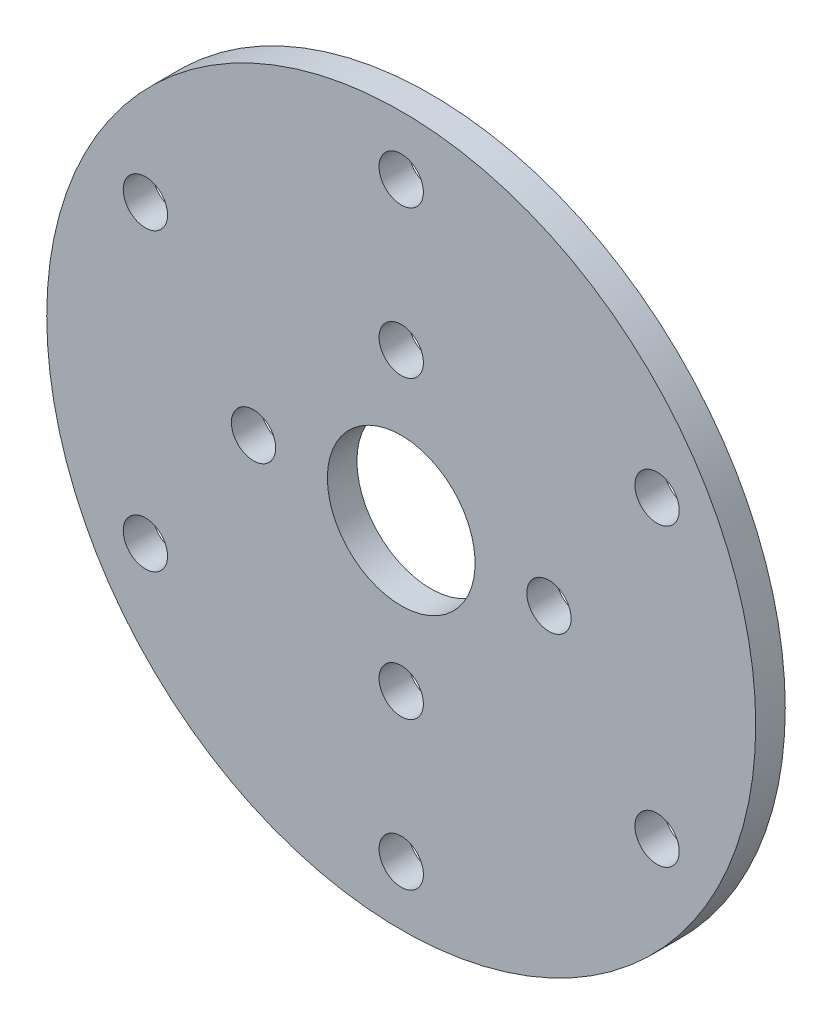
ISO-10303-21;
HEADER;
FILE_DESCRIPTION(('STEP AP214'),'2;1');
FILE_NAME('part.step','',(''),(''),'','','');
FILE_SCHEMA(('AUTOMOTIVE_DESIGN { 1 0 10303 214 1 1 1 1 }'));
ENDSEC;
DATA;
#1=APPLICATION_CONTEXT('core data for automotive mechanical design processes');
#2=APPLICATION_PROTOCOL_DEFINITION('international standard','automotive_design',2000,#1);
#3=PRODUCT_CONTEXT('',#1,'mechanical');
#4=PRODUCT('Part','Part','',(#3));
#5=PRODUCT_RELATED_PRODUCT_CATEGORY('part','',(#4));
#6=PRODUCT_DEFINITION_FORMATION('','',#4);
#7=PRODUCT_DEFINITION_CONTEXT('part definition',#1,'design');
#8=PRODUCT_DEFINITION('design','',#6,#7);
#9=PRODUCT_DEFINITION_SHAPE('','',#8);
#10=(LENGTH_UNIT() NAMED_UNIT(*) SI_UNIT(.MILLI.,.METRE.));
#11=(NAMED_UNIT(*) PLANE_ANGLE_UNIT() SI_UNIT($,.RADIAN.));
#12=(NAMED_UNIT(*) SI_UNIT($,.STERADIAN.) SOLID_ANGLE_UNIT());
#13=UNCERTAINTY_MEASURE_WITH_UNIT(LENGTH_MEASURE(1.E-05),#10,'distance_accuracy_value','');
#14=(GEOMETRIC_REPRESENTATION_CONTEXT(3) GLOBAL_UNCERTAINTY_ASSIGNED_CONTEXT((#13)) GLOBAL_UNIT_ASSIGNED_CONTEXT((#10,
#11,#12)) REPRESENTATION_CONTEXT('',''));
#15=CARTESIAN_POINT('',(0.,0.,0.));
#16=DIRECTION('',(0.,0.,1.));
#17=DIRECTION('',(1.,0.,0.));
#18=AXIS2_PLACEMENT_3D('',#15,#16,#17);
#19=CARTESIAN_POINT('',(0.,0.,0.));
#20=DIRECTION('',(0.,0.,1.));
#21=DIRECTION('',(1.,0.,0.));
#22=AXIS2_PLACEMENT_3D('',#19,#20,#21);
#23=CYLINDRICAL_SURFACE('',#22,24.);
#24=CARTESIAN_POINT('',(0.,0.,0.));
#25=DIRECTION('',(0.,0.,1.));
#26=DIRECTION('',(-1.,0.,0.));
#27=AXIS2_PLACEMENT_3D('',#24,#25,#26);
#28=CIRCLE('',#27,24.);
#29=CARTESIAN_POINT('',(-24.,0.,0.));
#30=VERTEX_POINT('',#29);
#31=EDGE_CURVE('E10',#30,#30,#28,.T.);
#32=ORIENTED_EDGE('',*,*,#31,.T.);
#33=EDGE_LOOP('',(#32));
#34=FACE_BOUND('',#33,.T.);
#35=CARTESIAN_POINT('',(0.,0.,2.));
#36=DIRECTION('',(0.,0.,1.));
#37=DIRECTION('',(-1.,0.,0.));
#38=AXIS2_PLACEMENT_3D('',#35,#36,#37);
#39=CIRCLE('',#38,24.);
#40=CARTESIAN_POINT('',(-24.,0.,2.));
#41=VERTEX_POINT('',#40);
#42=EDGE_CURVE('E33',#41,#41,#39,.T.);
#43=ORIENTED_EDGE('',*,*,#42,.F.);
#44=EDGE_LOOP('',(#43));
#45=FACE_BOUND('',#44,.T.);
#46=ADVANCED_FACE('F30',(#34,#45),#23,.T.);
#47=CARTESIAN_POINT('',(0.,0.,0.));
#48=DIRECTION('',(0.,0.,-1.));
#49=DIRECTION('',(-1.,0.,0.));
#50=AXIS2_PLACEMENT_3D('',#47,#48,#49);
#51=PLANE('',#50);
#52=CARTESIAN_POINT('',(10.,0.,0.));
#53=DIRECTION('',(0.,0.,1.));
#54=DIRECTION('',(-1.,0.,0.));
#55=AXIS2_PLACEMENT_3D('',#52,#53,#54);
#56=CIRCLE('',#55,1.5);
#57=CARTESIAN_POINT('',(8.5,0.,0.));
#58=VERTEX_POINT('',#57);
#59=EDGE_CURVE('E99',#58,#58,#56,.T.);
#60=ORIENTED_EDGE('',*,*,#59,.T.);
#61=EDGE_LOOP('',(#60));
#62=FACE_BOUND('',#61,.T.);
#63=CARTESIAN_POINT('',(0.,-10.,0.));
#64=DIRECTION('',(0.,0.,1.));
#65=DIRECTION('',(-1.,0.,0.));
#66=AXIS2_PLACEMENT_3D('',#63,#64,#65);
#67=CIRCLE('',#66,1.5);
#68=CARTESIAN_POINT('',(-1.5,-10.,0.));
#69=VERTEX_POINT('',#68);
#70=EDGE_CURVE('E93',#69,#69,#67,.T.);
#71=ORIENTED_EDGE('',*,*,#70,.T.);
#72=EDGE_LOOP('',(#71));
#73=FACE_BOUND('',#72,.T.);
#74=CARTESIAN_POINT('',(-10.,0.,0.));
#75=DIRECTION('',(0.,0.,1.));
#76=DIRECTION('',(-1.,0.,0.));
#77=AXIS2_PLACEMENT_3D('',#74,#75,#76);
#78=CIRCLE('',#77,1.5);
#79=CARTESIAN_POINT('',(-11.5,0.,0.));
#80=VERTEX_POINT('',#79);
#81=EDGE_CURVE('E87',#80,#80,#78,.T.);
#82=ORIENTED_EDGE('',*,*,#81,.T.);
#83=EDGE_LOOP('',(#82));
#84=FACE_BOUND('',#83,.T.);
#85=CARTESIAN_POINT('',(0.,10.,0.));
#86=DIRECTION('',(0.,0.,1.));
#87=DIRECTION('',(-1.,0.,0.));
#88=AXIS2_PLACEMENT_3D('',#85,#86,#87);
#89=CIRCLE('',#88,1.5);
#90=CARTESIAN_POINT('',(-1.5,10.,0.));
#91=VERTEX_POINT('',#90);
#92=EDGE_CURVE('E81',#91,#91,#89,.T.);
#93=ORIENTED_EDGE('',*,*,#92,.T.);
#94=EDGE_LOOP('',(#93));
#95=FACE_BOUND('',#94,.T.);
#96=CARTESIAN_POINT('',(-17.3205080756888,-10.,0.));
#97=DIRECTION('',(0.,0.,1.));
#98=DIRECTION('',(-1.,0.,0.));
#99=AXIS2_PLACEMENT_3D('',#96,#97,#98);
#100=CIRCLE('',#99,1.5);
#101=CARTESIAN_POINT('',(-18.8205080756888,-10.,0.));
#102=VERTEX_POINT('',#101);
#103=EDGE_CURVE('E75',#102,#102,#100,.T.);
#104=ORIENTED_EDGE('',*,*,#103,.T.);
#105=EDGE_LOOP('',(#104));
#106=FACE_BOUND('',#105,.T.);
#107=CARTESIAN_POINT('',(17.3205080756888,-10.,0.));
#108=DIRECTION('',(0.,0.,1.));
#109=DIRECTION('',(-1.,0.,0.));
#110=AXIS2_PLACEMENT_3D('',#107,#108,#109);
#111=CIRCLE('',#110,1.5);
#112=CARTESIAN_POINT('',(15.8205080756888,-10.,0.));
#113=VERTEX_POINT('',#112);
#114=EDGE_CURVE('E69',#113,#113,#111,.T.);
#115=ORIENTED_EDGE('',*,*,#114,.T.);
#116=EDGE_LOOP('',(#115));
#117=FACE_BOUND('',#116,.T.);
#118=CARTESIAN_POINT('',(0.,20.,0.));
#119=DIRECTION('',(0.,0.,1.));
#120=DIRECTION('',(-1.,0.,0.));
#121=AXIS2_PLACEMENT_3D('',#118,#119,#120);
#122=CIRCLE('',#121,1.5);
#123=CARTESIAN_POINT('',(-1.5,20.,0.));
#124=VERTEX_POINT('',#123);
#125=EDGE_CURVE('E63',#124,#124,#122,.T.);
#126=ORIENTED_EDGE('',*,*,#125,.T.);
#127=EDGE_LOOP('',(#126));
#128=FACE_BOUND('',#127,.T.);
#129=CARTESIAN_POINT('',(0.,0.,0.));
#130=DIRECTION('',(0.,0.,1.));
#131=DIRECTION('',(-1.,0.,0.));
#132=AXIS2_PLACEMENT_3D('',#129,#130,#131);
#133=CIRCLE('',#132,5.);
#134=CARTESIAN_POINT('',(-5.,0.,0.));
#135=VERTEX_POINT('',#134);
#136=EDGE_CURVE('E57',#135,#135,#133,.T.);
#137=ORIENTED_EDGE('',*,*,#136,.T.);
#138=EDGE_LOOP('',(#137));
#139=FACE_BOUND('',#138,.T.);
#140=CARTESIAN_POINT('',(17.3205080756888,10.,0.));
#141=DIRECTION('',(0.,0.,1.));
#142=DIRECTION('',(-1.,0.,0.));
#143=AXIS2_PLACEMENT_3D('',#140,#141,#142);
#144=CIRCLE('',#143,1.5);
#145=CARTESIAN_POINT('',(15.8205080756888,10.,0.));
#146=VERTEX_POINT('',#145);
#147=EDGE_CURVE('E51',#146,#146,#144,.T.);
#148=ORIENTED_EDGE('',*,*,#147,.T.);
#149=EDGE_LOOP('',(#148));
#150=FACE_BOUND('',#149,.T.);
#151=CARTESIAN_POINT('',(0.,-20.,0.));
#152=DIRECTION('',(0.,0.,1.));
#153=DIRECTION('',(-1.,0.,0.));
#154=AXIS2_PLACEMENT_3D('',#151,#152,#153);
#155=CIRCLE('',#154,1.5);
#156=CARTESIAN_POINT('',(-1.5,-20.,0.));
#157=VERTEX_POINT('',#156);
#158=EDGE_CURVE('E45',#157,#157,#155,.T.);
#159=ORIENTED_EDGE('',*,*,#158,.T.);
#160=EDGE_LOOP('',(#159));
#161=FACE_BOUND('',#160,.T.);
#162=CARTESIAN_POINT('',(-17.3205080756888,9.99999999999999,0.));
#163=DIRECTION('',(0.,0.,1.));
#164=DIRECTION('',(-1.,0.,0.));
#165=AXIS2_PLACEMENT_3D('',#162,#163,#164);
#166=CIRCLE('',#165,1.5);
#167=CARTESIAN_POINT('',(-18.8205080756888,9.99999999999999,0.));
#168=VERTEX_POINT('',#167);
#169=EDGE_CURVE('E40',#168,#168,#166,.T.);
#170=ORIENTED_EDGE('',*,*,#169,.T.);
#171=EDGE_LOOP('',(#170));
#172=FACE_BOUND('',#171,.T.);
#173=ORIENTED_EDGE('',*,*,#31,.F.);
#174=EDGE_LOOP('',(#173));
#175=FACE_BOUND('',#174,.T.);
#176=ADVANCED_FACE('F108',(#62,#73,#84,#95,#106,#117,#128,#139,#150,#161,#172,#175),#51,.T.);
#177=CARTESIAN_POINT('',(0.,0.,2.));
#178=DIRECTION('',(0.,0.,-1.));
#179=DIRECTION('',(-1.,0.,0.));
#180=AXIS2_PLACEMENT_3D('',#177,#178,#179);
#181=PLANE('',#180);
#182=CARTESIAN_POINT('',(10.,0.,2.));
#183=DIRECTION('',(0.,0.,1.));
#184=DIRECTION('',(-1.,0.,0.));
#185=AXIS2_PLACEMENT_3D('',#182,#183,#184);
#186=CIRCLE('',#185,1.5);
#187=CARTESIAN_POINT('',(8.5,0.,2.));
#188=VERTEX_POINT('',#187);
#189=EDGE_CURVE('E102',#188,#188,#186,.T.);
#190=ORIENTED_EDGE('',*,*,#189,.F.);
#191=EDGE_LOOP('',(#190));
#192=FACE_BOUND('',#191,.T.);
#193=CARTESIAN_POINT('',(0.,-10.,2.));
#194=DIRECTION('',(0.,0.,1.));
#195=DIRECTION('',(-1.,0.,0.));
#196=AXIS2_PLACEMENT_3D('',#193,#194,#195);
#197=CIRCLE('',#196,1.5);
#198=CARTESIAN_POINT('',(-1.5,-10.,2.));
#199=VERTEX_POINT('',#198);
#200=EDGE_CURVE('E96',#199,#199,#197,.T.);
#201=ORIENTED_EDGE('',*,*,#200,.F.);
#202=EDGE_LOOP('',(#201));
#203=FACE_BOUND('',#202,.T.);
#204=CARTESIAN_POINT('',(-10.,0.,2.));
#205=DIRECTION('',(0.,0.,1.));
#206=DIRECTION('',(-1.,0.,0.));
#207=AXIS2_PLACEMENT_3D('',#204,#205,#206);
#208=CIRCLE('',#207,1.5);
#209=CARTESIAN_POINT('',(-11.5,0.,2.));
#210=VERTEX_POINT('',#209);
#211=EDGE_CURVE('E90',#210,#210,#208,.T.);
#212=ORIENTED_EDGE('',*,*,#211,.F.);
#213=EDGE_LOOP('',(#212));
#214=FACE_BOUND('',#213,.T.);
#215=CARTESIAN_POINT('',(0.,10.,2.));
#216=DIRECTION('',(0.,0.,1.));
#217=DIRECTION('',(-1.,0.,0.));
#218=AXIS2_PLACEMENT_3D('',#215,#216,#217);
#219=CIRCLE('',#218,1.5);
#220=CARTESIAN_POINT('',(-1.5,10.,2.));
#221=VERTEX_POINT('',#220);
#222=EDGE_CURVE('E84',#221,#221,#219,.T.);
#223=ORIENTED_EDGE('',*,*,#222,.F.);
#224=EDGE_LOOP('',(#223));
#225=FACE_BOUND('',#224,.T.);
#226=CARTESIAN_POINT('',(-17.3205080756888,-10.,2.));
#227=DIRECTION('',(0.,0.,1.));
#228=DIRECTION('',(-1.,0.,0.));
#229=AXIS2_PLACEMENT_3D('',#226,#227,#228);
#230=CIRCLE('',#229,1.5);
#231=CARTESIAN_POINT('',(-18.8205080756888,-10.,2.));
#232=VERTEX_POINT('',#231);
#233=EDGE_CURVE('E78',#232,#232,#230,.T.);
#234=ORIENTED_EDGE('',*,*,#233,.F.);
#235=EDGE_LOOP('',(#234));
#236=FACE_BOUND('',#235,.T.);
#237=CARTESIAN_POINT('',(17.3205080756888,-10.,2.));
#238=DIRECTION('',(0.,0.,1.));
#239=DIRECTION('',(-1.,0.,0.));
#240=AXIS2_PLACEMENT_3D('',#237,#238,#239);
#241=CIRCLE('',#240,1.5);
#242=CARTESIAN_POINT('',(15.8205080756888,-10.,2.));
#243=VERTEX_POINT('',#242);
#244=EDGE_CURVE('E72',#243,#243,#241,.T.);
#245=ORIENTED_EDGE('',*,*,#244,.F.);
#246=EDGE_LOOP('',(#245));
#247=FACE_BOUND('',#246,.T.);
#248=CARTESIAN_POINT('',(0.,20.,2.));
#249=DIRECTION('',(0.,0.,1.));
#250=DIRECTION('',(-1.,0.,0.));
#251=AXIS2_PLACEMENT_3D('',#248,#249,#250);
#252=CIRCLE('',#251,1.5);
#253=CARTESIAN_POINT('',(-1.5,20.,2.));
#254=VERTEX_POINT('',#253);
#255=EDGE_CURVE('E66',#254,#254,#252,.T.);
#256=ORIENTED_EDGE('',*,*,#255,.F.);
#257=EDGE_LOOP('',(#256));
#258=FACE_BOUND('',#257,.T.);
#259=CARTESIAN_POINT('',(0.,0.,2.));
#260=DIRECTION('',(0.,0.,1.));
#261=DIRECTION('',(-1.,0.,0.));
#262=AXIS2_PLACEMENT_3D('',#259,#260,#261);
#263=CIRCLE('',#262,5.);
#264=CARTESIAN_POINT('',(-5.,0.,2.));
#265=VERTEX_POINT('',#264);
#266=EDGE_CURVE('E60',#265,#265,#263,.T.);
#267=ORIENTED_EDGE('',*,*,#266,.F.);
#268=EDGE_LOOP('',(#267));
#269=FACE_BOUND('',#268,.T.);
#270=CARTESIAN_POINT('',(17.3205080756888,10.,2.));
#271=DIRECTION('',(0.,0.,1.));
#272=DIRECTION('',(-1.,0.,0.));
#273=AXIS2_PLACEMENT_3D('',#270,#271,#272);
#274=CIRCLE('',#273,1.5);
#275=CARTESIAN_POINT('',(15.8205080756888,10.,2.));
#276=VERTEX_POINT('',#275);
#277=EDGE_CURVE('E54',#276,#276,#274,.T.);
#278=ORIENTED_EDGE('',*,*,#277,.F.);
#279=EDGE_LOOP('',(#278));
#280=FACE_BOUND('',#279,.T.);
#281=CARTESIAN_POINT('',(0.,-20.,2.));
#282=DIRECTION('',(0.,0.,1.));
#283=DIRECTION('',(-1.,0.,0.));
#284=AXIS2_PLACEMENT_3D('',#281,#282,#283);
#285=CIRCLE('',#284,1.5);
#286=CARTESIAN_POINT('',(-1.5,-20.,2.));
#287=VERTEX_POINT('',#286);
#288=EDGE_CURVE('E48',#287,#287,#285,.T.);
#289=ORIENTED_EDGE('',*,*,#288,.F.);
#290=EDGE_LOOP('',(#289));
#291=FACE_BOUND('',#290,.T.);
#292=CARTESIAN_POINT('',(-17.3205080756888,9.99999999999999,2.));
#293=DIRECTION('',(0.,0.,1.));
#294=DIRECTION('',(-1.,0.,0.));
#295=AXIS2_PLACEMENT_3D('',#292,#293,#294);
#296=CIRCLE('',#295,1.5);
#297=CARTESIAN_POINT('',(-18.8205080756888,9.99999999999999,2.));
#298=VERTEX_POINT('',#297);
#299=EDGE_CURVE('E42',#298,#298,#296,.T.);
#300=ORIENTED_EDGE('',*,*,#299,.F.);
#301=EDGE_LOOP('',(#300));
#302=FACE_BOUND('',#301,.T.);
#303=ORIENTED_EDGE('',*,*,#42,.T.);
#304=EDGE_LOOP('',(#303));
#305=FACE_BOUND('',#304,.T.);
#306=ADVANCED_FACE('F118',(#192,#203,#214,#225,#236,#247,#258,#269,#280,#291,#302,#305),#181,.F.);
#307=CARTESIAN_POINT('',(-17.3205080756888,9.99999999999999,0.));
#308=DIRECTION('',(0.,0.,1.));
#309=DIRECTION('',(1.,0.,0.));
#310=AXIS2_PLACEMENT_3D('',#307,#308,#309);
#311=CYLINDRICAL_SURFACE('',#310,1.5);
#312=ORIENTED_EDGE('',*,*,#169,.F.);
#313=EDGE_LOOP('',(#312));
#314=FACE_BOUND('',#313,.T.);
#315=ORIENTED_EDGE('',*,*,#299,.T.);
#316=EDGE_LOOP('',(#315));
#317=FACE_BOUND('',#316,.T.);
#318=ADVANCED_FACE('F121',(#314,#317),#311,.F.);
#319=CARTESIAN_POINT('',(0.,-20.,0.));
#320=DIRECTION('',(0.,0.,1.));
#321=DIRECTION('',(1.,0.,0.));
#322=AXIS2_PLACEMENT_3D('',#319,#320,#321);
#323=CYLINDRICAL_SURFACE('',#322,1.5);
#324=ORIENTED_EDGE('',*,*,#158,.F.);
#325=EDGE_LOOP('',(#324));
#326=FACE_BOUND('',#325,.T.);
#327=ORIENTED_EDGE('',*,*,#288,.T.);
#328=EDGE_LOOP('',(#327));
#329=FACE_BOUND('',#328,.T.);
#330=ADVANCED_FACE('F154',(#326,#329),#323,.F.);
#331=CARTESIAN_POINT('',(17.3205080756888,10.,0.));
#332=DIRECTION('',(0.,0.,1.));
#333=DIRECTION('',(1.,0.,0.));
#334=AXIS2_PLACEMENT_3D('',#331,#332,#333);
#335=CYLINDRICAL_SURFACE('',#334,1.5);
#336=ORIENTED_EDGE('',*,*,#147,.F.);
#337=EDGE_LOOP('',(#336));
#338=FACE_BOUND('',#337,.T.);
#339=ORIENTED_EDGE('',*,*,#277,.T.);
#340=EDGE_LOOP('',(#339));
#341=FACE_BOUND('',#340,.T.);
#342=ADVANCED_FACE('F158',(#338,#341),#335,.F.);
#343=CARTESIAN_POINT('',(0.,0.,0.));
#344=DIRECTION('',(0.,0.,1.));
#345=DIRECTION('',(1.,0.,0.));
#346=AXIS2_PLACEMENT_3D('',#343,#344,#345);
#347=CYLINDRICAL_SURFACE('',#346,5.);
#348=ORIENTED_EDGE('',*,*,#136,.F.);
#349=EDGE_LOOP('',(#348));
#350=FACE_BOUND('',#349,.T.);
#351=ORIENTED_EDGE('',*,*,#266,.T.);
#352=EDGE_LOOP('',(#351));
#353=FACE_BOUND('',#352,.T.);
#354=ADVANCED_FACE('F162',(#350,#353),#347,.F.);
#355=CARTESIAN_POINT('',(0.,20.,0.));
#356=DIRECTION('',(0.,0.,1.));
#357=DIRECTION('',(1.,0.,0.));
#358=AXIS2_PLACEMENT_3D('',#355,#356,#357);
#359=CYLINDRICAL_SURFACE('',#358,1.5);
#360=ORIENTED_EDGE('',*,*,#125,.F.);
#361=EDGE_LOOP('',(#360));
#362=FACE_BOUND('',#361,.T.);
#363=ORIENTED_EDGE('',*,*,#255,.T.);
#364=EDGE_LOOP('',(#363));
#365=FACE_BOUND('',#364,.T.);
#366=ADVANCED_FACE('F166',(#362,#365),#359,.F.);
#367=CARTESIAN_POINT('',(17.3205080756888,-10.,0.));
#368=DIRECTION('',(0.,0.,1.));
#369=DIRECTION('',(1.,0.,0.));
#370=AXIS2_PLACEMENT_3D('',#367,#368,#369);
#371=CYLINDRICAL_SURFACE('',#370,1.5);
#372=ORIENTED_EDGE('',*,*,#114,.F.);
#373=EDGE_LOOP('',(#372));
#374=FACE_BOUND('',#373,.T.);
#375=ORIENTED_EDGE('',*,*,#244,.T.);
#376=EDGE_LOOP('',(#375));
#377=FACE_BOUND('',#376,.T.);
#378=ADVANCED_FACE('F170',(#374,#377),#371,.F.);
#379=CARTESIAN_POINT('',(-17.3205080756888,-10.,0.));
#380=DIRECTION('',(0.,0.,1.));
#381=DIRECTION('',(1.,0.,0.));
#382=AXIS2_PLACEMENT_3D('',#379,#380,#381);
#383=CYLINDRICAL_SURFACE('',#382,1.5);
#384=ORIENTED_EDGE('',*,*,#103,.F.);
#385=EDGE_LOOP('',(#384));
#386=FACE_BOUND('',#385,.T.);
#387=ORIENTED_EDGE('',*,*,#233,.T.);
#388=EDGE_LOOP('',(#387));
#389=FACE_BOUND('',#388,.T.);
#390=ADVANCED_FACE('F174',(#386,#389),#383,.F.);
#391=CARTESIAN_POINT('',(0.,10.,0.));
#392=DIRECTION('',(0.,0.,1.));
#393=DIRECTION('',(1.,0.,0.));
#394=AXIS2_PLACEMENT_3D('',#391,#392,#393);
#395=CYLINDRICAL_SURFACE('',#394,1.5);
#396=ORIENTED_EDGE('',*,*,#92,.F.);
#397=EDGE_LOOP('',(#396));
#398=FACE_BOUND('',#397,.T.);
#399=ORIENTED_EDGE('',*,*,#222,.T.);
#400=EDGE_LOOP('',(#399));
#401=FACE_BOUND('',#400,.T.);
#402=ADVANCED_FACE('F178',(#398,#401),#395,.F.);
#403=CARTESIAN_POINT('',(-10.,0.,0.));
#404=DIRECTION('',(0.,0.,1.));
#405=DIRECTION('',(1.,0.,0.));
#406=AXIS2_PLACEMENT_3D('',#403,#404,#405);
#407=CYLINDRICAL_SURFACE('',#406,1.5);
#408=ORIENTED_EDGE('',*,*,#81,.F.);
#409=EDGE_LOOP('',(#408));
#410=FACE_BOUND('',#409,.T.);
#411=ORIENTED_EDGE('',*,*,#211,.T.);
#412=EDGE_LOOP('',(#411));
#413=FACE_BOUND('',#412,.T.);
#414=ADVANCED_FACE('F182',(#410,#413),#407,.F.);
#415=CARTESIAN_POINT('',(0.,-10.,0.));
#416=DIRECTION('',(0.,0.,1.));
#417=DIRECTION('',(1.,0.,0.));
#418=AXIS2_PLACEMENT_3D('',#415,#416,#417);
#419=CYLINDRICAL_SURFACE('',#418,1.5);
#420=ORIENTED_EDGE('',*,*,#70,.F.);
#421=EDGE_LOOP('',(#420));
#422=FACE_BOUND('',#421,.T.);
#423=ORIENTED_EDGE('',*,*,#200,.T.);
#424=EDGE_LOOP('',(#423));
#425=FACE_BOUND('',#424,.T.);
#426=ADVANCED_FACE('F114',(#422,#425),#419,.F.);
#427=CARTESIAN_POINT('',(10.,0.,0.));
#428=DIRECTION('',(0.,0.,1.));
#429=DIRECTION('',(1.,0.,0.));
#430=AXIS2_PLACEMENT_3D('',#427,#428,#429);
#431=CYLINDRICAL_SURFACE('',#430,1.5);
#432=ORIENTED_EDGE('',*,*,#59,.F.);
#433=EDGE_LOOP('',(#432));
#434=FACE_BOUND('',#433,.T.);
#435=ORIENTED_EDGE('',*,*,#189,.T.);
#436=EDGE_LOOP('',(#435));
#437=FACE_BOUND('',#436,.T.);
#438=ADVANCED_FACE('F111',(#434,#437),#431,.F.);
#439=CLOSED_SHELL('',(#46,#176,#306,#318,#330,#342,#354,#366,#378,#390,#402,#414,#426,#438));
#440=MANIFOLD_SOLID_BREP('B2',#439);
#441=ADVANCED_BREP_SHAPE_REPRESENTATION('',(#18,#440),#14);
#442=SHAPE_DEFINITION_REPRESENTATION(#9,#441);
ENDSEC;
END-ISO-10303-21;
